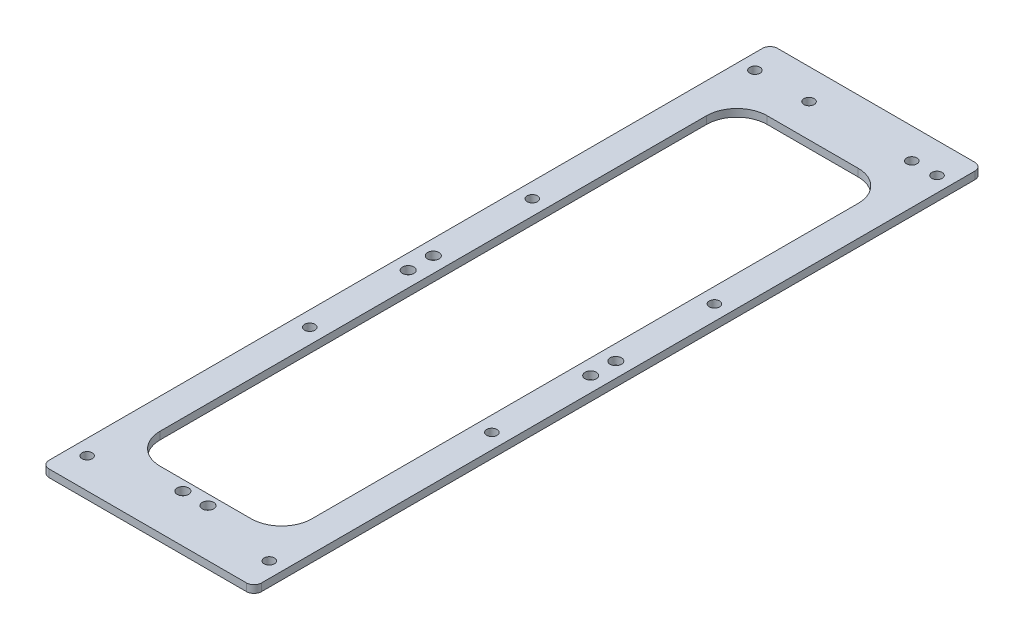
ISO-10303-21;
HEADER;
FILE_DESCRIPTION(('STEP AP214'),'2;1');
FILE_NAME('part.step','',(''),(''),'','','');
FILE_SCHEMA(('AUTOMOTIVE_DESIGN { 1 0 10303 214 1 1 1 1 }'));
ENDSEC;
DATA;
#1=APPLICATION_CONTEXT('core data for automotive mechanical design processes');
#2=APPLICATION_PROTOCOL_DEFINITION('international standard','automotive_design',2000,#1);
#3=PRODUCT_CONTEXT('',#1,'mechanical');
#4=PRODUCT('Part','Part','',(#3));
#5=PRODUCT_RELATED_PRODUCT_CATEGORY('part','',(#4));
#6=PRODUCT_DEFINITION_FORMATION('','',#4);
#7=PRODUCT_DEFINITION_CONTEXT('part definition',#1,'design');
#8=PRODUCT_DEFINITION('design','',#6,#7);
#9=PRODUCT_DEFINITION_SHAPE('','',#8);
#10=(LENGTH_UNIT() NAMED_UNIT(*) SI_UNIT(.MILLI.,.METRE.));
#11=(NAMED_UNIT(*) PLANE_ANGLE_UNIT() SI_UNIT($,.RADIAN.));
#12=(NAMED_UNIT(*) SI_UNIT($,.STERADIAN.) SOLID_ANGLE_UNIT());
#13=UNCERTAINTY_MEASURE_WITH_UNIT(LENGTH_MEASURE(1.E-05),#10,'distance_accuracy_value','');
#14=(GEOMETRIC_REPRESENTATION_CONTEXT(3) GLOBAL_UNCERTAINTY_ASSIGNED_CONTEXT((#13)) GLOBAL_UNIT_ASSIGNED_CONTEXT((#10,
#11,#12)) REPRESENTATION_CONTEXT('',''));
#15=CARTESIAN_POINT('',(0.,0.,0.));
#16=DIRECTION('',(0.,0.,1.));
#17=DIRECTION('',(1.,0.,0.));
#18=AXIS2_PLACEMENT_3D('',#15,#16,#17);
#19=CARTESIAN_POINT('',(0.,3.175,0.));
#20=DIRECTION('',(0.,1.,0.));
#21=DIRECTION('',(0.,0.,1.));
#22=AXIS2_PLACEMENT_3D('',#19,#20,#21);
#23=PLANE('',#22);
#24=CARTESIAN_POINT('',(38.1811171147674,3.175,-5.24625));
#25=DIRECTION('',(0.,1.,0.));
#26=DIRECTION('',(0.,0.,-1.));
#27=AXIS2_PLACEMENT_3D('',#24,#25,#26);
#28=CIRCLE('',#27,2.38125);
#29=CARTESIAN_POINT('',(38.1811171147674,3.175,-7.62749999999999));
#30=VERTEX_POINT('',#29);
#31=EDGE_CURVE('E360',#30,#30,#28,.T.);
#32=ORIENTED_EDGE('',*,*,#31,.F.);
#33=EDGE_LOOP('',(#32));
#34=FACE_BOUND('',#33,.T.);
#35=CARTESIAN_POINT('',(38.1811171147674,3.175,5.24625));
#36=DIRECTION('',(0.,1.,0.));
#37=DIRECTION('',(0.,0.,1.));
#38=AXIS2_PLACEMENT_3D('',#35,#36,#37);
#39=CIRCLE('',#38,2.38125);
#40=CARTESIAN_POINT('',(38.1811171147674,3.175,7.6275));
#41=VERTEX_POINT('',#40);
#42=EDGE_CURVE('E366',#41,#41,#39,.T.);
#43=ORIENTED_EDGE('',*,*,#42,.F.);
#44=EDGE_LOOP('',(#43));
#45=FACE_BOUND('',#44,.T.);
#46=CARTESIAN_POINT('',(-38.1811171147674,3.175,5.24625));
#47=DIRECTION('',(0.,1.,0.));
#48=DIRECTION('',(0.,0.,-1.));
#49=AXIS2_PLACEMENT_3D('',#46,#47,#48);
#50=CIRCLE('',#49,2.38125);
#51=CARTESIAN_POINT('',(-38.1811171147674,3.175,2.86500000000001));
#52=VERTEX_POINT('',#51);
#53=EDGE_CURVE('E372',#52,#52,#50,.T.);
#54=ORIENTED_EDGE('',*,*,#53,.F.);
#55=EDGE_LOOP('',(#54));
#56=FACE_BOUND('',#55,.T.);
#57=CARTESIAN_POINT('',(-38.1811171147674,3.175,-5.24625));
#58=DIRECTION('',(0.,1.,0.));
#59=DIRECTION('',(0.,0.,1.));
#60=AXIS2_PLACEMENT_3D('',#57,#58,#59);
#61=CIRCLE('',#60,2.38125);
#62=CARTESIAN_POINT('',(-38.1811171147674,3.175,-2.865));
#63=VERTEX_POINT('',#62);
#64=EDGE_CURVE('E354',#63,#63,#61,.T.);
#65=ORIENTED_EDGE('',*,*,#64,.F.);
#66=EDGE_LOOP('',(#65));
#67=FACE_BOUND('',#66,.T.);
#68=CARTESIAN_POINT('',(-5.24624998499998,3.175,132.45823257716));
#69=DIRECTION('',(0.,1.,0.));
#70=DIRECTION('',(0.,0.,1.));
#71=AXIS2_PLACEMENT_3D('',#68,#69,#70);
#72=CIRCLE('',#71,2.38125);
#73=CARTESIAN_POINT('',(-5.24624998499998,3.175,134.83948257716));
#74=VERTEX_POINT('',#73);
#75=EDGE_CURVE('E349',#74,#74,#72,.T.);
#76=ORIENTED_EDGE('',*,*,#75,.F.);
#77=EDGE_LOOP('',(#76));
#78=FACE_BOUND('',#77,.T.);
#79=CARTESIAN_POINT('',(5.24624998500002,3.175,132.45823257716));
#80=DIRECTION('',(0.,1.,0.));
#81=DIRECTION('',(0.,0.,-1.));
#82=AXIS2_PLACEMENT_3D('',#79,#80,#81);
#83=CIRCLE('',#82,2.38125);
#84=CARTESIAN_POINT('',(5.24624998500002,3.175,130.07698257716));
#85=VERTEX_POINT('',#84);
#86=EDGE_CURVE('E342',#85,#85,#83,.T.);
#87=ORIENTED_EDGE('',*,*,#86,.F.);
#88=EDGE_LOOP('',(#87));
#89=FACE_BOUND('',#88,.T.);
#90=CARTESIAN_POINT('',(-15.4178,3.175,-139.7));
#91=DIRECTION('',(0.,1.,0.));
#92=DIRECTION('',(0.,0.,1.));
#93=AXIS2_PLACEMENT_3D('',#90,#91,#92);
#94=CIRCLE('',#93,2.15899999999999);
#95=CARTESIAN_POINT('',(-15.4178,3.175,-137.541));
#96=VERTEX_POINT('',#95);
#97=EDGE_CURVE('E337',#96,#96,#94,.T.);
#98=ORIENTED_EDGE('',*,*,#97,.F.);
#99=EDGE_LOOP('',(#98));
#100=FACE_BOUND('',#99,.T.);
#101=CARTESIAN_POINT('',(27.5844,3.175,-139.7));
#102=DIRECTION('',(0.,1.,0.));
#103=DIRECTION('',(0.,0.,1.));
#104=AXIS2_PLACEMENT_3D('',#101,#102,#103);
#105=CIRCLE('',#104,2.15899999999999);
#106=CARTESIAN_POINT('',(27.5844,3.175,-137.541));
#107=VERTEX_POINT('',#106);
#108=EDGE_CURVE('E333',#107,#107,#105,.T.);
#109=ORIENTED_EDGE('',*,*,#108,.F.);
#110=EDGE_LOOP('',(#109));
#111=FACE_BOUND('',#110,.T.);
#112=CARTESIAN_POINT('',(38.1,3.175,-46.6021183814132));
#113=DIRECTION('',(0.,1.,0.));
#114=DIRECTION('',(0.,0.,-1.));
#115=AXIS2_PLACEMENT_3D('',#112,#113,#114);
#116=CIRCLE('',#115,2.15899999999998);
#117=CARTESIAN_POINT('',(38.1,3.175,-48.7611183814132));
#118=VERTEX_POINT('',#117);
#119=EDGE_CURVE('E300',#118,#118,#116,.T.);
#120=ORIENTED_EDGE('',*,*,#119,.F.);
#121=EDGE_LOOP('',(#120));
#122=FACE_BOUND('',#121,.T.);
#123=CARTESIAN_POINT('',(-38.1,3.175,139.663955618587));
#124=DIRECTION('',(0.,1.,0.));
#125=DIRECTION('',(0.,0.,1.));
#126=AXIS2_PLACEMENT_3D('',#123,#124,#125);
#127=CIRCLE('',#126,2.15899999999998);
#128=CARTESIAN_POINT('',(-38.1,3.175,141.822955618587));
#129=VERTEX_POINT('',#128);
#130=EDGE_CURVE('E307',#129,#129,#127,.T.);
#131=ORIENTED_EDGE('',*,*,#130,.F.);
#132=EDGE_LOOP('',(#131));
#133=FACE_BOUND('',#132,.T.);
#134=CARTESIAN_POINT('',(-38.1,3.175,46.5305376185868));
#135=DIRECTION('',(0.,1.,0.));
#136=DIRECTION('',(0.,0.,1.));
#137=AXIS2_PLACEMENT_3D('',#134,#135,#136);
#138=CIRCLE('',#137,2.15899999999998);
#139=CARTESIAN_POINT('',(-38.1,3.175,48.6895376185868));
#140=VERTEX_POINT('',#139);
#141=EDGE_CURVE('E288',#140,#140,#138,.T.);
#142=ORIENTED_EDGE('',*,*,#141,.F.);
#143=EDGE_LOOP('',(#142));
#144=FACE_BOUND('',#143,.T.);
#145=CARTESIAN_POINT('',(-38.1,3.175,-46.6028803814132));
#146=DIRECTION('',(0.,1.,0.));
#147=DIRECTION('',(0.,0.,1.));
#148=AXIS2_PLACEMENT_3D('',#145,#146,#147);
#149=CIRCLE('',#148,2.15899999999998);
#150=CARTESIAN_POINT('',(-38.1,3.175,-44.4438803814132));
#151=VERTEX_POINT('',#150);
#152=EDGE_CURVE('E295',#151,#151,#149,.T.);
#153=ORIENTED_EDGE('',*,*,#152,.F.);
#154=EDGE_LOOP('',(#153));
#155=FACE_BOUND('',#154,.T.);
#156=CARTESIAN_POINT('',(38.1,3.175,46.5320616185868));
#157=DIRECTION('',(0.,1.,0.));
#158=DIRECTION('',(0.,0.,-1.));
#159=AXIS2_PLACEMENT_3D('',#156,#157,#158);
#160=CIRCLE('',#159,2.15899999999998);
#161=CARTESIAN_POINT('',(38.1,3.175,44.3730616185868));
#162=VERTEX_POINT('',#161);
#163=EDGE_CURVE('E325',#162,#162,#160,.T.);
#164=ORIENTED_EDGE('',*,*,#163,.F.);
#165=EDGE_LOOP('',(#164));
#166=FACE_BOUND('',#165,.T.);
#167=CARTESIAN_POINT('',(38.1,3.175,139.666241618587));
#168=DIRECTION('',(0.,1.,0.));
#169=DIRECTION('',(0.,0.,-1.));
#170=AXIS2_PLACEMENT_3D('',#167,#168,#169);
#171=CIRCLE('',#170,2.15899999999998);
#172=CARTESIAN_POINT('',(38.1,3.175,137.507241618587));
#173=VERTEX_POINT('',#172);
#174=EDGE_CURVE('E319',#173,#173,#171,.T.);
#175=ORIENTED_EDGE('',*,*,#174,.F.);
#176=EDGE_LOOP('',(#175));
#177=FACE_BOUND('',#176,.T.);
#178=CARTESIAN_POINT('',(38.1,3.175,-139.736298381413));
#179=DIRECTION('',(0.,1.,0.));
#180=DIRECTION('',(0.,0.,-1.));
#181=AXIS2_PLACEMENT_3D('',#178,#179,#180);
#182=CIRCLE('',#181,2.15899999999998);
#183=CARTESIAN_POINT('',(38.1,3.175,-141.895298381413));
#184=VERTEX_POINT('',#183);
#185=EDGE_CURVE('E312',#184,#184,#182,.T.);
#186=ORIENTED_EDGE('',*,*,#185,.F.);
#187=EDGE_LOOP('',(#186));
#188=FACE_BOUND('',#187,.T.);
#189=CARTESIAN_POINT('',(-38.1,3.175,-139.736298381413));
#190=DIRECTION('',(0.,1.,0.));
#191=DIRECTION('',(0.,0.,1.));
#192=AXIS2_PLACEMENT_3D('',#189,#190,#191);
#193=CIRCLE('',#192,2.15899999999998);
#194=CARTESIAN_POINT('',(-38.1,3.175,-137.577298381413));
#195=VERTEX_POINT('',#194);
#196=EDGE_CURVE('E282',#195,#195,#193,.T.);
#197=ORIENTED_EDGE('',*,*,#196,.F.);
#198=EDGE_LOOP('',(#197));
#199=FACE_BOUND('',#198,.T.);
#200=DIRECTION('',(0.,0.,1.));
#201=VECTOR('',#200,1.);
#202=CARTESIAN_POINT('',(-44.45,3.175,-152.4));
#203=LINE('',#202,#201);
#204=CARTESIAN_POINT('',(-44.45,3.175,-149.225));
#205=VERTEX_POINT('',#204);
#206=CARTESIAN_POINT('',(-44.45,3.175,149.225));
#207=VERTEX_POINT('',#206);
#208=EDGE_CURVE('E253',#205,#207,#203,.T.);
#209=ORIENTED_EDGE('',*,*,#208,.T.);
#210=CARTESIAN_POINT('',(-41.275,3.175,149.225));
#211=DIRECTION('',(0.,1.,0.));
#212=DIRECTION('',(0.,0.,1.));
#213=AXIS2_PLACEMENT_3D('',#210,#211,#212);
#214=CIRCLE('',#213,3.175);
#215=CARTESIAN_POINT('',(-41.275,3.175,152.4));
#216=VERTEX_POINT('',#215);
#217=EDGE_CURVE('E232',#207,#216,#214,.T.);
#218=ORIENTED_EDGE('',*,*,#217,.T.);
#219=DIRECTION('',(1.,0.,0.));
#220=VECTOR('',#219,1.);
#221=CARTESIAN_POINT('',(-44.45,3.175,152.4));
#222=LINE('',#221,#220);
#223=CARTESIAN_POINT('',(41.275,3.175,152.4));
#224=VERTEX_POINT('',#223);
#225=EDGE_CURVE('E261',#216,#224,#222,.T.);
#226=ORIENTED_EDGE('',*,*,#225,.T.);
#227=CARTESIAN_POINT('',(41.275,3.175,149.225));
#228=DIRECTION('',(0.,1.,0.));
#229=DIRECTION('',(0.,0.,1.));
#230=AXIS2_PLACEMENT_3D('',#227,#228,#229);
#231=CIRCLE('',#230,3.175);
#232=CARTESIAN_POINT('',(44.45,3.175,149.225));
#233=VERTEX_POINT('',#232);
#234=EDGE_CURVE('E230',#224,#233,#231,.T.);
#235=ORIENTED_EDGE('',*,*,#234,.T.);
#236=DIRECTION('',(0.,0.,-1.));
#237=VECTOR('',#236,1.);
#238=CARTESIAN_POINT('',(44.45,3.175,-152.4));
#239=LINE('',#238,#237);
#240=CARTESIAN_POINT('',(44.45,3.175,-149.225));
#241=VERTEX_POINT('',#240);
#242=EDGE_CURVE('E178',#233,#241,#239,.T.);
#243=ORIENTED_EDGE('',*,*,#242,.T.);
#244=CARTESIAN_POINT('',(41.275,3.175,-149.225));
#245=DIRECTION('',(0.,1.,0.));
#246=DIRECTION('',(0.,0.,1.));
#247=AXIS2_PLACEMENT_3D('',#244,#245,#246);
#248=CIRCLE('',#247,3.175);
#249=CARTESIAN_POINT('',(41.275,3.175,-152.4));
#250=VERTEX_POINT('',#249);
#251=EDGE_CURVE('E55',#241,#250,#248,.T.);
#252=ORIENTED_EDGE('',*,*,#251,.T.);
#253=DIRECTION('',(-1.,0.,0.));
#254=VECTOR('',#253,1.);
#255=CARTESIAN_POINT('',(-44.45,3.175,-152.4));
#256=LINE('',#255,#254);
#257=CARTESIAN_POINT('',(-41.275,3.175,-152.4));
#258=VERTEX_POINT('',#257);
#259=EDGE_CURVE('E174',#250,#258,#256,.T.);
#260=ORIENTED_EDGE('',*,*,#259,.T.);
#261=CARTESIAN_POINT('',(-41.275,3.175,-149.225));
#262=DIRECTION('',(0.,1.,0.));
#263=DIRECTION('',(0.,0.,1.));
#264=AXIS2_PLACEMENT_3D('',#261,#262,#263);
#265=CIRCLE('',#264,3.175);
#266=EDGE_CURVE('E227',#258,#205,#265,.T.);
#267=ORIENTED_EDGE('',*,*,#266,.T.);
#268=EDGE_LOOP('',(#209,#218,#226,#235,#243,#252,#260,#267));
#269=FACE_BOUND('',#268,.T.);
#270=DIRECTION('',(1.,0.,0.));
#271=VECTOR('',#270,1.);
#272=CARTESIAN_POINT('',(-31.75,3.175,128.17693257716));
#273=LINE('',#272,#271);
#274=CARTESIAN_POINT('',(-19.05,3.175,128.17693257716));
#275=VERTEX_POINT('',#274);
#276=CARTESIAN_POINT('',(19.05,3.175,128.17693257716));
#277=VERTEX_POINT('',#276);
#278=EDGE_CURVE('E278',#275,#277,#273,.T.);
#279=ORIENTED_EDGE('',*,*,#278,.F.);
#280=CARTESIAN_POINT('',(-19.05,3.175,115.47693257716));
#281=DIRECTION('',(0.,1.,0.));
#282=DIRECTION('',(0.,0.,1.));
#283=AXIS2_PLACEMENT_3D('',#280,#281,#282);
#284=CIRCLE('',#283,12.7);
#285=CARTESIAN_POINT('',(-31.75,3.175,115.47693257716));
#286=VERTEX_POINT('',#285);
#287=EDGE_CURVE('E159',#275,#286,#284,.F.);
#288=ORIENTED_EDGE('',*,*,#287,.T.);
#289=DIRECTION('',(0.,0.,1.));
#290=VECTOR('',#289,1.);
#291=CARTESIAN_POINT('',(-31.75,3.175,-125.82306742284));
#292=LINE('',#291,#290);
#293=CARTESIAN_POINT('',(-31.75,3.175,-113.12306742284));
#294=VERTEX_POINT('',#293);
#295=EDGE_CURVE('E268',#294,#286,#292,.T.);
#296=ORIENTED_EDGE('',*,*,#295,.F.);
#297=CARTESIAN_POINT('',(-19.05,3.175,-113.12306742284));
#298=DIRECTION('',(0.,1.,0.));
#299=DIRECTION('',(0.,0.,1.));
#300=AXIS2_PLACEMENT_3D('',#297,#298,#299);
#301=CIRCLE('',#300,12.7);
#302=CARTESIAN_POINT('',(-19.05,3.175,-125.82306742284));
#303=VERTEX_POINT('',#302);
#304=EDGE_CURVE('E203',#294,#303,#301,.F.);
#305=ORIENTED_EDGE('',*,*,#304,.T.);
#306=DIRECTION('',(-1.,0.,0.));
#307=VECTOR('',#306,1.);
#308=CARTESIAN_POINT('',(-31.75,3.175,-125.82306742284));
#309=LINE('',#308,#307);
#310=CARTESIAN_POINT('',(19.05,3.175,-125.82306742284));
#311=VERTEX_POINT('',#310);
#312=EDGE_CURVE('E258',#311,#303,#309,.T.);
#313=ORIENTED_EDGE('',*,*,#312,.F.);
#314=CARTESIAN_POINT('',(19.0500000000001,3.175,-113.12306742284));
#315=DIRECTION('',(0.,1.,0.));
#316=DIRECTION('',(0.,0.,1.));
#317=AXIS2_PLACEMENT_3D('',#314,#315,#316);
#318=CIRCLE('',#317,12.7);
#319=CARTESIAN_POINT('',(31.75,3.175,-113.12306742284));
#320=VERTEX_POINT('',#319);
#321=EDGE_CURVE('E207',#311,#320,#318,.F.);
#322=ORIENTED_EDGE('',*,*,#321,.T.);
#323=DIRECTION('',(0.,0.,-1.));
#324=VECTOR('',#323,1.);
#325=CARTESIAN_POINT('',(31.75,3.175,-125.82306742284));
#326=LINE('',#325,#324);
#327=CARTESIAN_POINT('',(31.75,3.175,115.47693257716));
#328=VERTEX_POINT('',#327);
#329=EDGE_CURVE('E275',#328,#320,#326,.T.);
#330=ORIENTED_EDGE('',*,*,#329,.F.);
#331=CARTESIAN_POINT('',(19.05,3.175,115.47693257716));
#332=DIRECTION('',(0.,1.,0.));
#333=DIRECTION('',(0.,0.,1.));
#334=AXIS2_PLACEMENT_3D('',#331,#332,#333);
#335=CIRCLE('',#334,12.7);
#336=EDGE_CURVE('E160',#328,#277,#335,.F.);
#337=ORIENTED_EDGE('',*,*,#336,.T.);
#338=EDGE_LOOP('',(#279,#288,#296,#305,#313,#322,#330,#337));
#339=FACE_BOUND('',#338,.T.);
#340=ADVANCED_FACE('F34',(#34,#45,#56,#67,#78,#89,#100,#111,#122,#133,#144,#155,#166,#177,#188,
#199,#269,#339),#23,.T.);
#341=CARTESIAN_POINT('',(0.,0.,0.));
#342=DIRECTION('',(0.,1.,0.));
#343=DIRECTION('',(0.,0.,1.));
#344=AXIS2_PLACEMENT_3D('',#341,#342,#343);
#345=PLANE('',#344);
#346=CARTESIAN_POINT('',(38.1811171147674,0.,-5.24625));
#347=DIRECTION('',(0.,1.,0.));
#348=DIRECTION('',(0.,0.,-1.));
#349=AXIS2_PLACEMENT_3D('',#346,#347,#348);
#350=CIRCLE('',#349,2.38125);
#351=CARTESIAN_POINT('',(38.1811171147674,0.,-7.62749999999999));
#352=VERTEX_POINT('',#351);
#353=EDGE_CURVE('E363',#352,#352,#350,.T.);
#354=ORIENTED_EDGE('',*,*,#353,.T.);
#355=EDGE_LOOP('',(#354));
#356=FACE_BOUND('',#355,.T.);
#357=CARTESIAN_POINT('',(38.1811171147674,0.,5.24625));
#358=DIRECTION('',(0.,1.,0.));
#359=DIRECTION('',(0.,0.,1.));
#360=AXIS2_PLACEMENT_3D('',#357,#358,#359);
#361=CIRCLE('',#360,2.38125);
#362=CARTESIAN_POINT('',(38.1811171147674,0.,7.6275));
#363=VERTEX_POINT('',#362);
#364=EDGE_CURVE('E369',#363,#363,#361,.T.);
#365=ORIENTED_EDGE('',*,*,#364,.T.);
#366=EDGE_LOOP('',(#365));
#367=FACE_BOUND('',#366,.T.);
#368=CARTESIAN_POINT('',(-38.1811171147674,0.,5.24625));
#369=DIRECTION('',(0.,1.,0.));
#370=DIRECTION('',(0.,0.,-1.));
#371=AXIS2_PLACEMENT_3D('',#368,#369,#370);
#372=CIRCLE('',#371,2.38125);
#373=CARTESIAN_POINT('',(-38.1811171147674,0.,2.86500000000001));
#374=VERTEX_POINT('',#373);
#375=EDGE_CURVE('E357',#374,#374,#372,.T.);
#376=ORIENTED_EDGE('',*,*,#375,.T.);
#377=EDGE_LOOP('',(#376));
#378=FACE_BOUND('',#377,.T.);
#379=CARTESIAN_POINT('',(-38.1811171147674,0.,-5.24625));
#380=DIRECTION('',(0.,1.,0.));
#381=DIRECTION('',(0.,0.,1.));
#382=AXIS2_PLACEMENT_3D('',#379,#380,#381);
#383=CIRCLE('',#382,2.38125);
#384=CARTESIAN_POINT('',(-38.1811171147674,0.,-2.865));
#385=VERTEX_POINT('',#384);
#386=EDGE_CURVE('E346',#385,#385,#383,.T.);
#387=ORIENTED_EDGE('',*,*,#386,.T.);
#388=EDGE_LOOP('',(#387));
#389=FACE_BOUND('',#388,.T.);
#390=CARTESIAN_POINT('',(-5.24624998499998,0.,132.45823257716));
#391=DIRECTION('',(0.,1.,0.));
#392=DIRECTION('',(0.,0.,1.));
#393=AXIS2_PLACEMENT_3D('',#390,#391,#392);
#394=CIRCLE('',#393,2.38125);
#395=CARTESIAN_POINT('',(-5.24624998499998,0.,134.83948257716));
#396=VERTEX_POINT('',#395);
#397=EDGE_CURVE('E334',#396,#396,#394,.T.);
#398=ORIENTED_EDGE('',*,*,#397,.T.);
#399=EDGE_LOOP('',(#398));
#400=FACE_BOUND('',#399,.T.);
#401=CARTESIAN_POINT('',(5.24624998500002,0.,132.45823257716));
#402=DIRECTION('',(0.,1.,0.));
#403=DIRECTION('',(0.,0.,-1.));
#404=AXIS2_PLACEMENT_3D('',#401,#402,#403);
#405=CIRCLE('',#404,2.38125);
#406=CARTESIAN_POINT('',(5.24624998500002,0.,130.07698257716));
#407=VERTEX_POINT('',#406);
#408=EDGE_CURVE('E345',#407,#407,#405,.T.);
#409=ORIENTED_EDGE('',*,*,#408,.T.);
#410=EDGE_LOOP('',(#409));
#411=FACE_BOUND('',#410,.T.);
#412=CARTESIAN_POINT('',(-15.4178,0.,-139.7));
#413=DIRECTION('',(0.,1.,0.));
#414=DIRECTION('',(0.,0.,1.));
#415=AXIS2_PLACEMENT_3D('',#412,#413,#414);
#416=CIRCLE('',#415,2.15899999999999);
#417=CARTESIAN_POINT('',(-15.4178,0.,-137.541));
#418=VERTEX_POINT('',#417);
#419=EDGE_CURVE('E316',#418,#418,#416,.T.);
#420=ORIENTED_EDGE('',*,*,#419,.T.);
#421=EDGE_LOOP('',(#420));
#422=FACE_BOUND('',#421,.T.);
#423=CARTESIAN_POINT('',(27.5844,0.,-139.7));
#424=DIRECTION('',(0.,1.,0.));
#425=DIRECTION('',(0.,0.,1.));
#426=AXIS2_PLACEMENT_3D('',#423,#424,#425);
#427=CIRCLE('',#426,2.15899999999999);
#428=CARTESIAN_POINT('',(27.5844,0.,-137.541));
#429=VERTEX_POINT('',#428);
#430=EDGE_CURVE('E330',#429,#429,#427,.T.);
#431=ORIENTED_EDGE('',*,*,#430,.T.);
#432=EDGE_LOOP('',(#431));
#433=FACE_BOUND('',#432,.T.);
#434=CARTESIAN_POINT('',(38.1,0.,-46.6021183814132));
#435=DIRECTION('',(0.,1.,0.));
#436=DIRECTION('',(0.,0.,-1.));
#437=AXIS2_PLACEMENT_3D('',#434,#435,#436);
#438=CIRCLE('',#437,2.15899999999998);
#439=CARTESIAN_POINT('',(38.1,0.,-48.7611183814132));
#440=VERTEX_POINT('',#439);
#441=EDGE_CURVE('E303',#440,#440,#438,.T.);
#442=ORIENTED_EDGE('',*,*,#441,.T.);
#443=EDGE_LOOP('',(#442));
#444=FACE_BOUND('',#443,.T.);
#445=CARTESIAN_POINT('',(-38.1,0.,139.663955618587));
#446=DIRECTION('',(0.,1.,0.));
#447=DIRECTION('',(0.,0.,1.));
#448=AXIS2_PLACEMENT_3D('',#445,#446,#447);
#449=CIRCLE('',#448,2.15899999999998);
#450=CARTESIAN_POINT('',(-38.1,0.,141.822955618587));
#451=VERTEX_POINT('',#450);
#452=EDGE_CURVE('E292',#451,#451,#449,.T.);
#453=ORIENTED_EDGE('',*,*,#452,.T.);
#454=EDGE_LOOP('',(#453));
#455=FACE_BOUND('',#454,.T.);
#456=CARTESIAN_POINT('',(-38.1,0.,46.5305376185868));
#457=DIRECTION('',(0.,1.,0.));
#458=DIRECTION('',(0.,0.,1.));
#459=AXIS2_PLACEMENT_3D('',#456,#457,#458);
#460=CIRCLE('',#459,2.15899999999998);
#461=CARTESIAN_POINT('',(-38.1,0.,48.6895376185868));
#462=VERTEX_POINT('',#461);
#463=EDGE_CURVE('E291',#462,#462,#460,.T.);
#464=ORIENTED_EDGE('',*,*,#463,.T.);
#465=EDGE_LOOP('',(#464));
#466=FACE_BOUND('',#465,.T.);
#467=CARTESIAN_POINT('',(-38.1,0.,-46.6028803814132));
#468=DIRECTION('',(0.,1.,0.));
#469=DIRECTION('',(0.,0.,1.));
#470=AXIS2_PLACEMENT_3D('',#467,#468,#469);
#471=CIRCLE('',#470,2.15899999999998);
#472=CARTESIAN_POINT('',(-38.1,0.,-44.4438803814132));
#473=VERTEX_POINT('',#472);
#474=EDGE_CURVE('E285',#473,#473,#471,.T.);
#475=ORIENTED_EDGE('',*,*,#474,.T.);
#476=EDGE_LOOP('',(#475));
#477=FACE_BOUND('',#476,.T.);
#478=CARTESIAN_POINT('',(38.1,0.,46.5320616185868));
#479=DIRECTION('',(0.,1.,0.));
#480=DIRECTION('',(0.,0.,-1.));
#481=AXIS2_PLACEMENT_3D('',#478,#479,#480);
#482=CIRCLE('',#481,2.15899999999998);
#483=CARTESIAN_POINT('',(38.1,0.,44.3730616185868));
#484=VERTEX_POINT('',#483);
#485=EDGE_CURVE('E304',#484,#484,#482,.T.);
#486=ORIENTED_EDGE('',*,*,#485,.T.);
#487=EDGE_LOOP('',(#486));
#488=FACE_BOUND('',#487,.T.);
#489=CARTESIAN_POINT('',(38.1,0.,139.666241618587));
#490=DIRECTION('',(0.,1.,0.));
#491=DIRECTION('',(0.,0.,-1.));
#492=AXIS2_PLACEMENT_3D('',#489,#490,#491);
#493=CIRCLE('',#492,2.15899999999998);
#494=CARTESIAN_POINT('',(38.1,0.,137.507241618587));
#495=VERTEX_POINT('',#494);
#496=EDGE_CURVE('E322',#495,#495,#493,.T.);
#497=ORIENTED_EDGE('',*,*,#496,.T.);
#498=EDGE_LOOP('',(#497));
#499=FACE_BOUND('',#498,.T.);
#500=CARTESIAN_POINT('',(38.1,0.,-139.736298381413));
#501=DIRECTION('',(0.,1.,0.));
#502=DIRECTION('',(0.,0.,-1.));
#503=AXIS2_PLACEMENT_3D('',#500,#501,#502);
#504=CIRCLE('',#503,2.15899999999998);
#505=CARTESIAN_POINT('',(38.1,0.,-141.895298381413));
#506=VERTEX_POINT('',#505);
#507=EDGE_CURVE('E315',#506,#506,#504,.T.);
#508=ORIENTED_EDGE('',*,*,#507,.T.);
#509=EDGE_LOOP('',(#508));
#510=FACE_BOUND('',#509,.T.);
#511=CARTESIAN_POINT('',(-38.1,0.,-139.736298381413));
#512=DIRECTION('',(0.,1.,0.));
#513=DIRECTION('',(0.,0.,1.));
#514=AXIS2_PLACEMENT_3D('',#511,#512,#513);
#515=CIRCLE('',#514,2.15899999999998);
#516=CARTESIAN_POINT('',(-38.1,0.,-137.577298381413));
#517=VERTEX_POINT('',#516);
#518=EDGE_CURVE('E272',#517,#517,#515,.T.);
#519=ORIENTED_EDGE('',*,*,#518,.T.);
#520=EDGE_LOOP('',(#519));
#521=FACE_BOUND('',#520,.T.);
#522=DIRECTION('',(1.,0.,0.));
#523=VECTOR('',#522,1.);
#524=CARTESIAN_POINT('',(-44.45,0.,152.4));
#525=LINE('',#524,#523);
#526=CARTESIAN_POINT('',(-41.275,0.,152.4));
#527=VERTEX_POINT('',#526);
#528=CARTESIAN_POINT('',(41.275,0.,152.4));
#529=VERTEX_POINT('',#528);
#530=EDGE_CURVE('E252',#527,#529,#525,.T.);
#531=ORIENTED_EDGE('',*,*,#530,.F.);
#532=CARTESIAN_POINT('',(-41.275,0.,149.225));
#533=DIRECTION('',(0.,1.,0.));
#534=DIRECTION('',(0.,0.,1.));
#535=AXIS2_PLACEMENT_3D('',#532,#533,#534);
#536=CIRCLE('',#535,3.175);
#537=CARTESIAN_POINT('',(-44.45,0.,149.225));
#538=VERTEX_POINT('',#537);
#539=EDGE_CURVE('E220',#527,#538,#536,.F.);
#540=ORIENTED_EDGE('',*,*,#539,.T.);
#541=DIRECTION('',(0.,0.,1.));
#542=VECTOR('',#541,1.);
#543=CARTESIAN_POINT('',(-44.45,0.,-152.4));
#544=LINE('',#543,#542);
#545=CARTESIAN_POINT('',(-44.45,0.,-149.225));
#546=VERTEX_POINT('',#545);
#547=EDGE_CURVE('E254',#546,#538,#544,.T.);
#548=ORIENTED_EDGE('',*,*,#547,.F.);
#549=CARTESIAN_POINT('',(-41.275,0.,-149.225));
#550=DIRECTION('',(0.,1.,0.));
#551=DIRECTION('',(0.,0.,1.));
#552=AXIS2_PLACEMENT_3D('',#549,#550,#551);
#553=CIRCLE('',#552,3.175);
#554=CARTESIAN_POINT('',(-41.275,0.,-152.4));
#555=VERTEX_POINT('',#554);
#556=EDGE_CURVE('E214',#546,#555,#553,.F.);
#557=ORIENTED_EDGE('',*,*,#556,.T.);
#558=DIRECTION('',(-1.,0.,0.));
#559=VECTOR('',#558,1.);
#560=CARTESIAN_POINT('',(-44.45,0.,-152.4));
#561=LINE('',#560,#559);
#562=CARTESIAN_POINT('',(41.275,0.,-152.4));
#563=VERTEX_POINT('',#562);
#564=EDGE_CURVE('E181',#563,#555,#561,.T.);
#565=ORIENTED_EDGE('',*,*,#564,.F.);
#566=CARTESIAN_POINT('',(41.275,0.,-149.225));
#567=DIRECTION('',(0.,1.,0.));
#568=DIRECTION('',(0.,0.,1.));
#569=AXIS2_PLACEMENT_3D('',#566,#567,#568);
#570=CIRCLE('',#569,3.175);
#571=CARTESIAN_POINT('',(44.45,0.,-149.225));
#572=VERTEX_POINT('',#571);
#573=EDGE_CURVE('E216',#563,#572,#570,.F.);
#574=ORIENTED_EDGE('',*,*,#573,.T.);
#575=DIRECTION('',(0.,0.,-1.));
#576=VECTOR('',#575,1.);
#577=CARTESIAN_POINT('',(44.45,0.,-152.4));
#578=LINE('',#577,#576);
#579=CARTESIAN_POINT('',(44.45,0.,149.225));
#580=VERTEX_POINT('',#579);
#581=EDGE_CURVE('E244',#580,#572,#578,.T.);
#582=ORIENTED_EDGE('',*,*,#581,.F.);
#583=CARTESIAN_POINT('',(41.275,0.,149.225));
#584=DIRECTION('',(0.,1.,0.));
#585=DIRECTION('',(0.,0.,1.));
#586=AXIS2_PLACEMENT_3D('',#583,#584,#585);
#587=CIRCLE('',#586,3.175);
#588=EDGE_CURVE('E218',#580,#529,#587,.F.);
#589=ORIENTED_EDGE('',*,*,#588,.T.);
#590=EDGE_LOOP('',(#531,#540,#548,#557,#565,#574,#582,#589));
#591=FACE_BOUND('',#590,.T.);
#592=DIRECTION('',(-1.,0.,0.));
#593=VECTOR('',#592,1.);
#594=CARTESIAN_POINT('',(-31.75,0.,-125.82306742284));
#595=LINE('',#594,#593);
#596=CARTESIAN_POINT('',(19.05,0.,-125.82306742284));
#597=VERTEX_POINT('',#596);
#598=CARTESIAN_POINT('',(-19.05,0.,-125.82306742284));
#599=VERTEX_POINT('',#598);
#600=EDGE_CURVE('E266',#597,#599,#595,.T.);
#601=ORIENTED_EDGE('',*,*,#600,.T.);
#602=CARTESIAN_POINT('',(-19.05,0.,-113.12306742284));
#603=DIRECTION('',(0.,1.,0.));
#604=DIRECTION('',(0.,0.,1.));
#605=AXIS2_PLACEMENT_3D('',#602,#603,#604);
#606=CIRCLE('',#605,12.7);
#607=CARTESIAN_POINT('',(-31.75,0.,-113.12306742284));
#608=VERTEX_POINT('',#607);
#609=EDGE_CURVE('E201',#599,#608,#606,.T.);
#610=ORIENTED_EDGE('',*,*,#609,.T.);
#611=DIRECTION('',(0.,0.,1.));
#612=VECTOR('',#611,1.);
#613=CARTESIAN_POINT('',(-31.75,0.,-125.82306742284));
#614=LINE('',#613,#612);
#615=CARTESIAN_POINT('',(-31.75,0.,115.47693257716));
#616=VERTEX_POINT('',#615);
#617=EDGE_CURVE('E154',#608,#616,#614,.T.);
#618=ORIENTED_EDGE('',*,*,#617,.T.);
#619=CARTESIAN_POINT('',(-19.05,0.,115.47693257716));
#620=DIRECTION('',(0.,1.,0.));
#621=DIRECTION('',(0.,0.,1.));
#622=AXIS2_PLACEMENT_3D('',#619,#620,#621);
#623=CIRCLE('',#622,12.7);
#624=CARTESIAN_POINT('',(-19.05,0.,128.17693257716));
#625=VERTEX_POINT('',#624);
#626=EDGE_CURVE('E148',#616,#625,#623,.T.);
#627=ORIENTED_EDGE('',*,*,#626,.T.);
#628=DIRECTION('',(1.,0.,0.));
#629=VECTOR('',#628,1.);
#630=CARTESIAN_POINT('',(-31.75,0.,128.17693257716));
#631=LINE('',#630,#629);
#632=CARTESIAN_POINT('',(19.05,0.,128.17693257716));
#633=VERTEX_POINT('',#632);
#634=EDGE_CURVE('E152',#625,#633,#631,.T.);
#635=ORIENTED_EDGE('',*,*,#634,.T.);
#636=CARTESIAN_POINT('',(19.05,0.,115.47693257716));
#637=DIRECTION('',(0.,1.,0.));
#638=DIRECTION('',(0.,0.,1.));
#639=AXIS2_PLACEMENT_3D('',#636,#637,#638);
#640=CIRCLE('',#639,12.7);
#641=CARTESIAN_POINT('',(31.75,0.,115.47693257716));
#642=VERTEX_POINT('',#641);
#643=EDGE_CURVE('E197',#633,#642,#640,.T.);
#644=ORIENTED_EDGE('',*,*,#643,.T.);
#645=DIRECTION('',(0.,0.,-1.));
#646=VECTOR('',#645,1.);
#647=CARTESIAN_POINT('',(31.75,0.,-125.82306742284));
#648=LINE('',#647,#646);
#649=CARTESIAN_POINT('',(31.75,0.,-113.12306742284));
#650=VERTEX_POINT('',#649);
#651=EDGE_CURVE('E170',#642,#650,#648,.T.);
#652=ORIENTED_EDGE('',*,*,#651,.T.);
#653=CARTESIAN_POINT('',(19.0500000000001,0.,-113.12306742284));
#654=DIRECTION('',(0.,1.,0.));
#655=DIRECTION('',(0.,0.,1.));
#656=AXIS2_PLACEMENT_3D('',#653,#654,#655);
#657=CIRCLE('',#656,12.7);
#658=EDGE_CURVE('E205',#650,#597,#657,.T.);
#659=ORIENTED_EDGE('',*,*,#658,.T.);
#660=EDGE_LOOP('',(#601,#610,#618,#627,#635,#644,#652,#659));
#661=FACE_BOUND('',#660,.T.);
#662=ADVANCED_FACE('F151',(#356,#367,#378,#389,#400,#411,#422,#433,#444,#455,#466,#477,#488,
#499,#510,#521,#591,#661),#345,.F.);
#663=CARTESIAN_POINT('',(-44.45,3.175,-152.4));
#664=DIRECTION('',(1.,0.,0.));
#665=DIRECTION('',(0.,0.,-1.));
#666=AXIS2_PLACEMENT_3D('',#663,#664,#665);
#667=PLANE('',#666);
#668=ORIENTED_EDGE('',*,*,#547,.T.);
#669=DIRECTION('',(0.,-1.,0.));
#670=VECTOR('',#669,1.);
#671=CARTESIAN_POINT('',(-44.45,3.175,149.225));
#672=LINE('',#671,#670);
#673=EDGE_CURVE('E225',#538,#207,#672,.F.);
#674=ORIENTED_EDGE('',*,*,#673,.T.);
#675=ORIENTED_EDGE('',*,*,#208,.F.);
#676=DIRECTION('',(0.,-1.,0.));
#677=VECTOR('',#676,1.);
#678=CARTESIAN_POINT('',(-44.45,3.175,-149.225));
#679=LINE('',#678,#677);
#680=EDGE_CURVE('E222',#205,#546,#679,.T.);
#681=ORIENTED_EDGE('',*,*,#680,.T.);
#682=EDGE_LOOP('',(#668,#674,#675,#681));
#683=FACE_BOUND('',#682,.T.);
#684=ADVANCED_FACE('F457',(#683),#667,.F.);
#685=CARTESIAN_POINT('',(-44.45,3.175,152.4));
#686=DIRECTION('',(0.,0.,-1.));
#687=DIRECTION('',(-1.,0.,0.));
#688=AXIS2_PLACEMENT_3D('',#685,#686,#687);
#689=PLANE('',#688);
#690=ORIENTED_EDGE('',*,*,#225,.F.);
#691=DIRECTION('',(0.,-1.,0.));
#692=VECTOR('',#691,1.);
#693=CARTESIAN_POINT('',(-41.275,3.175,152.4));
#694=LINE('',#693,#692);
#695=EDGE_CURVE('E211',#216,#527,#694,.T.);
#696=ORIENTED_EDGE('',*,*,#695,.T.);
#697=ORIENTED_EDGE('',*,*,#530,.T.);
#698=DIRECTION('',(0.,-1.,0.));
#699=VECTOR('',#698,1.);
#700=CARTESIAN_POINT('',(41.275,3.175,152.4));
#701=LINE('',#700,#699);
#702=EDGE_CURVE('E209',#529,#224,#701,.F.);
#703=ORIENTED_EDGE('',*,*,#702,.T.);
#704=EDGE_LOOP('',(#690,#696,#697,#703));
#705=FACE_BOUND('',#704,.T.);
#706=ADVANCED_FACE('F462',(#705),#689,.F.);
#707=CARTESIAN_POINT('',(44.45,3.175,-152.4));
#708=DIRECTION('',(-1.,0.,0.));
#709=DIRECTION('',(0.,0.,1.));
#710=AXIS2_PLACEMENT_3D('',#707,#708,#709);
#711=PLANE('',#710);
#712=ORIENTED_EDGE('',*,*,#242,.F.);
#713=DIRECTION('',(0.,-1.,0.));
#714=VECTOR('',#713,1.);
#715=CARTESIAN_POINT('',(44.45,3.175,149.225));
#716=LINE('',#715,#714);
#717=EDGE_CURVE('E236',#233,#580,#716,.T.);
#718=ORIENTED_EDGE('',*,*,#717,.T.);
#719=ORIENTED_EDGE('',*,*,#581,.T.);
#720=DIRECTION('',(0.,-1.,0.));
#721=VECTOR('',#720,1.);
#722=CARTESIAN_POINT('',(44.45,3.175,-149.225));
#723=LINE('',#722,#721);
#724=EDGE_CURVE('E234',#572,#241,#723,.F.);
#725=ORIENTED_EDGE('',*,*,#724,.T.);
#726=EDGE_LOOP('',(#712,#718,#719,#725));
#727=FACE_BOUND('',#726,.T.);
#728=ADVANCED_FACE('F243',(#727),#711,.F.);
#729=CARTESIAN_POINT('',(-44.45,3.175,-152.4));
#730=DIRECTION('',(0.,0.,1.));
#731=DIRECTION('',(1.,0.,0.));
#732=AXIS2_PLACEMENT_3D('',#729,#730,#731);
#733=PLANE('',#732);
#734=ORIENTED_EDGE('',*,*,#259,.F.);
#735=DIRECTION('',(0.,-1.,0.));
#736=VECTOR('',#735,1.);
#737=CARTESIAN_POINT('',(41.275,3.175,-152.4));
#738=LINE('',#737,#736);
#739=EDGE_CURVE('E11',#250,#563,#738,.T.);
#740=ORIENTED_EDGE('',*,*,#739,.T.);
#741=ORIENTED_EDGE('',*,*,#564,.T.);
#742=DIRECTION('',(0.,-1.,0.));
#743=VECTOR('',#742,1.);
#744=CARTESIAN_POINT('',(-41.275,3.175,-152.4));
#745=LINE('',#744,#743);
#746=EDGE_CURVE('E42',#555,#258,#745,.F.);
#747=ORIENTED_EDGE('',*,*,#746,.T.);
#748=EDGE_LOOP('',(#734,#740,#741,#747));
#749=FACE_BOUND('',#748,.T.);
#750=ADVANCED_FACE('F446',(#749),#733,.F.);
#751=CARTESIAN_POINT('',(-31.75,3.175,-125.82306742284));
#752=DIRECTION('',(1.,0.,0.));
#753=DIRECTION('',(0.,0.,-1.));
#754=AXIS2_PLACEMENT_3D('',#751,#752,#753);
#755=PLANE('',#754);
#756=ORIENTED_EDGE('',*,*,#295,.T.);
#757=DIRECTION('',(0.,-1.,0.));
#758=VECTOR('',#757,1.);
#759=CARTESIAN_POINT('',(-31.75,0.,115.47693257716));
#760=LINE('',#759,#758);
#761=EDGE_CURVE('E190',#286,#616,#760,.T.);
#762=ORIENTED_EDGE('',*,*,#761,.T.);
#763=ORIENTED_EDGE('',*,*,#617,.F.);
#764=DIRECTION('',(0.,-1.,0.));
#765=VECTOR('',#764,1.);
#766=CARTESIAN_POINT('',(-31.75,3.175,-113.12306742284));
#767=LINE('',#766,#765);
#768=EDGE_CURVE('E188',#608,#294,#767,.F.);
#769=ORIENTED_EDGE('',*,*,#768,.T.);
#770=EDGE_LOOP('',(#756,#762,#763,#769));
#771=FACE_BOUND('',#770,.T.);
#772=ADVANCED_FACE('F444',(#771),#755,.T.);
#773=CARTESIAN_POINT('',(-31.75,3.175,128.17693257716));
#774=DIRECTION('',(0.,0.,-1.));
#775=DIRECTION('',(-1.,0.,0.));
#776=AXIS2_PLACEMENT_3D('',#773,#774,#775);
#777=PLANE('',#776);
#778=ORIENTED_EDGE('',*,*,#278,.T.);
#779=DIRECTION('',(0.,-1.,0.));
#780=VECTOR('',#779,1.);
#781=CARTESIAN_POINT('',(19.05,0.,128.17693257716));
#782=LINE('',#781,#780);
#783=EDGE_CURVE('E169',#277,#633,#782,.T.);
#784=ORIENTED_EDGE('',*,*,#783,.T.);
#785=ORIENTED_EDGE('',*,*,#634,.F.);
#786=DIRECTION('',(0.,-1.,0.));
#787=VECTOR('',#786,1.);
#788=CARTESIAN_POINT('',(-19.05,3.175,128.17693257716));
#789=LINE('',#788,#787);
#790=EDGE_CURVE('E166',#625,#275,#789,.F.);
#791=ORIENTED_EDGE('',*,*,#790,.T.);
#792=EDGE_LOOP('',(#778,#784,#785,#791));
#793=FACE_BOUND('',#792,.T.);
#794=ADVANCED_FACE('F165',(#793),#777,.T.);
#795=CARTESIAN_POINT('',(31.75,3.175,-125.82306742284));
#796=DIRECTION('',(-1.,0.,0.));
#797=DIRECTION('',(0.,0.,1.));
#798=AXIS2_PLACEMENT_3D('',#795,#796,#797);
#799=PLANE('',#798);
#800=ORIENTED_EDGE('',*,*,#651,.F.);
#801=DIRECTION('',(0.,-1.,0.));
#802=VECTOR('',#801,1.);
#803=CARTESIAN_POINT('',(31.75,3.175,115.47693257716));
#804=LINE('',#803,#802);
#805=EDGE_CURVE('E186',#642,#328,#804,.F.);
#806=ORIENTED_EDGE('',*,*,#805,.T.);
#807=ORIENTED_EDGE('',*,*,#329,.T.);
#808=DIRECTION('',(0.,-1.,0.));
#809=VECTOR('',#808,1.);
#810=CARTESIAN_POINT('',(31.75,0.,-113.12306742284));
#811=LINE('',#810,#809);
#812=EDGE_CURVE('E176',#320,#650,#811,.T.);
#813=ORIENTED_EDGE('',*,*,#812,.T.);
#814=EDGE_LOOP('',(#800,#806,#807,#813));
#815=FACE_BOUND('',#814,.T.);
#816=ADVANCED_FACE('F428',(#815),#799,.T.);
#817=CARTESIAN_POINT('',(-31.75,3.175,-125.82306742284));
#818=DIRECTION('',(0.,0.,1.));
#819=DIRECTION('',(1.,0.,0.));
#820=AXIS2_PLACEMENT_3D('',#817,#818,#819);
#821=PLANE('',#820);
#822=ORIENTED_EDGE('',*,*,#312,.T.);
#823=DIRECTION('',(0.,-1.,0.));
#824=VECTOR('',#823,1.);
#825=CARTESIAN_POINT('',(-19.05,0.,-125.82306742284));
#826=LINE('',#825,#824);
#827=EDGE_CURVE('E194',#303,#599,#826,.T.);
#828=ORIENTED_EDGE('',*,*,#827,.T.);
#829=ORIENTED_EDGE('',*,*,#600,.F.);
#830=DIRECTION('',(0.,-1.,0.));
#831=VECTOR('',#830,1.);
#832=CARTESIAN_POINT('',(19.0500000000001,3.175,-125.82306742284));
#833=LINE('',#832,#831);
#834=EDGE_CURVE('E192',#597,#311,#833,.F.);
#835=ORIENTED_EDGE('',*,*,#834,.T.);
#836=EDGE_LOOP('',(#822,#828,#829,#835));
#837=FACE_BOUND('',#836,.T.);
#838=ADVANCED_FACE('F436',(#837),#821,.T.);
#839=CARTESIAN_POINT('',(-38.1,0.,-139.736298381413));
#840=DIRECTION('',(0.,1.,0.));
#841=DIRECTION('',(0.,0.,1.));
#842=AXIS2_PLACEMENT_3D('',#839,#840,#841);
#843=CYLINDRICAL_SURFACE('',#842,2.15899999999998);
#844=ORIENTED_EDGE('',*,*,#518,.F.);
#845=EDGE_LOOP('',(#844));
#846=FACE_BOUND('',#845,.T.);
#847=ORIENTED_EDGE('',*,*,#196,.T.);
#848=EDGE_LOOP('',(#847));
#849=FACE_BOUND('',#848,.T.);
#850=ADVANCED_FACE('F528',(#846,#849),#843,.F.);
#851=CARTESIAN_POINT('',(38.1,0.,-139.736298381413));
#852=DIRECTION('',(0.,1.,0.));
#853=DIRECTION('',(0.,0.,1.));
#854=AXIS2_PLACEMENT_3D('',#851,#852,#853);
#855=CYLINDRICAL_SURFACE('',#854,2.15899999999998);
#856=ORIENTED_EDGE('',*,*,#507,.F.);
#857=EDGE_LOOP('',(#856));
#858=FACE_BOUND('',#857,.T.);
#859=ORIENTED_EDGE('',*,*,#185,.T.);
#860=EDGE_LOOP('',(#859));
#861=FACE_BOUND('',#860,.T.);
#862=ADVANCED_FACE('F524',(#858,#861),#855,.F.);
#863=CARTESIAN_POINT('',(38.1,0.,139.666241618587));
#864=DIRECTION('',(0.,1.,0.));
#865=DIRECTION('',(0.,0.,1.));
#866=AXIS2_PLACEMENT_3D('',#863,#864,#865);
#867=CYLINDRICAL_SURFACE('',#866,2.15899999999998);
#868=ORIENTED_EDGE('',*,*,#496,.F.);
#869=EDGE_LOOP('',(#868));
#870=FACE_BOUND('',#869,.T.);
#871=ORIENTED_EDGE('',*,*,#174,.T.);
#872=EDGE_LOOP('',(#871));
#873=FACE_BOUND('',#872,.T.);
#874=ADVANCED_FACE('F520',(#870,#873),#867,.F.);
#875=CARTESIAN_POINT('',(38.1,0.,46.5320616185868));
#876=DIRECTION('',(0.,1.,0.));
#877=DIRECTION('',(0.,0.,1.));
#878=AXIS2_PLACEMENT_3D('',#875,#876,#877);
#879=CYLINDRICAL_SURFACE('',#878,2.15899999999998);
#880=ORIENTED_EDGE('',*,*,#485,.F.);
#881=EDGE_LOOP('',(#880));
#882=FACE_BOUND('',#881,.T.);
#883=ORIENTED_EDGE('',*,*,#163,.T.);
#884=EDGE_LOOP('',(#883));
#885=FACE_BOUND('',#884,.T.);
#886=ADVANCED_FACE('F516',(#882,#885),#879,.F.);
#887=CARTESIAN_POINT('',(-38.1,0.,-46.6028803814132));
#888=DIRECTION('',(0.,1.,0.));
#889=DIRECTION('',(0.,0.,1.));
#890=AXIS2_PLACEMENT_3D('',#887,#888,#889);
#891=CYLINDRICAL_SURFACE('',#890,2.15899999999998);
#892=ORIENTED_EDGE('',*,*,#474,.F.);
#893=EDGE_LOOP('',(#892));
#894=FACE_BOUND('',#893,.T.);
#895=ORIENTED_EDGE('',*,*,#152,.T.);
#896=EDGE_LOOP('',(#895));
#897=FACE_BOUND('',#896,.T.);
#898=ADVANCED_FACE('F519',(#894,#897),#891,.F.);
#899=CARTESIAN_POINT('',(-38.1,0.,46.5305376185868));
#900=DIRECTION('',(0.,1.,0.));
#901=DIRECTION('',(0.,0.,1.));
#902=AXIS2_PLACEMENT_3D('',#899,#900,#901);
#903=CYLINDRICAL_SURFACE('',#902,2.15899999999998);
#904=ORIENTED_EDGE('',*,*,#463,.F.);
#905=EDGE_LOOP('',(#904));
#906=FACE_BOUND('',#905,.T.);
#907=ORIENTED_EDGE('',*,*,#141,.T.);
#908=EDGE_LOOP('',(#907));
#909=FACE_BOUND('',#908,.T.);
#910=ADVANCED_FACE('F533',(#906,#909),#903,.F.);
#911=CARTESIAN_POINT('',(-38.1,0.,139.663955618587));
#912=DIRECTION('',(0.,1.,0.));
#913=DIRECTION('',(0.,0.,1.));
#914=AXIS2_PLACEMENT_3D('',#911,#912,#913);
#915=CYLINDRICAL_SURFACE('',#914,2.15899999999998);
#916=ORIENTED_EDGE('',*,*,#452,.F.);
#917=EDGE_LOOP('',(#916));
#918=FACE_BOUND('',#917,.T.);
#919=ORIENTED_EDGE('',*,*,#130,.T.);
#920=EDGE_LOOP('',(#919));
#921=FACE_BOUND('',#920,.T.);
#922=ADVANCED_FACE('F530',(#918,#921),#915,.F.);
#923=CARTESIAN_POINT('',(38.1,0.,-46.6021183814132));
#924=DIRECTION('',(0.,1.,0.));
#925=DIRECTION('',(0.,0.,1.));
#926=AXIS2_PLACEMENT_3D('',#923,#924,#925);
#927=CYLINDRICAL_SURFACE('',#926,2.15899999999998);
#928=ORIENTED_EDGE('',*,*,#441,.F.);
#929=EDGE_LOOP('',(#928));
#930=FACE_BOUND('',#929,.T.);
#931=ORIENTED_EDGE('',*,*,#119,.T.);
#932=EDGE_LOOP('',(#931));
#933=FACE_BOUND('',#932,.T.);
#934=ADVANCED_FACE('F471',(#930,#933),#927,.F.);
#935=CARTESIAN_POINT('',(19.05,3.175,115.47693257716));
#936=DIRECTION('',(0.,1.,0.));
#937=DIRECTION('',(0.,0.,1.));
#938=AXIS2_PLACEMENT_3D('',#935,#936,#937);
#939=CYLINDRICAL_SURFACE('',#938,12.7);
#940=ORIENTED_EDGE('',*,*,#336,.F.);
#941=ORIENTED_EDGE('',*,*,#805,.F.);
#942=ORIENTED_EDGE('',*,*,#643,.F.);
#943=ORIENTED_EDGE('',*,*,#783,.F.);
#944=EDGE_LOOP('',(#940,#941,#942,#943));
#945=FACE_BOUND('',#944,.T.);
#946=ADVANCED_FACE('F424',(#945),#939,.F.);
#947=CARTESIAN_POINT('',(-19.05,3.175,115.47693257716));
#948=DIRECTION('',(0.,1.,0.));
#949=DIRECTION('',(0.,0.,1.));
#950=AXIS2_PLACEMENT_3D('',#947,#948,#949);
#951=CYLINDRICAL_SURFACE('',#950,12.7);
#952=ORIENTED_EDGE('',*,*,#287,.F.);
#953=ORIENTED_EDGE('',*,*,#790,.F.);
#954=ORIENTED_EDGE('',*,*,#626,.F.);
#955=ORIENTED_EDGE('',*,*,#761,.F.);
#956=EDGE_LOOP('',(#952,#953,#954,#955));
#957=FACE_BOUND('',#956,.T.);
#958=ADVANCED_FACE('F173',(#957),#951,.F.);
#959=CARTESIAN_POINT('',(-19.05,3.175,-113.12306742284));
#960=DIRECTION('',(0.,1.,0.));
#961=DIRECTION('',(0.,0.,1.));
#962=AXIS2_PLACEMENT_3D('',#959,#960,#961);
#963=CYLINDRICAL_SURFACE('',#962,12.7);
#964=ORIENTED_EDGE('',*,*,#304,.F.);
#965=ORIENTED_EDGE('',*,*,#768,.F.);
#966=ORIENTED_EDGE('',*,*,#609,.F.);
#967=ORIENTED_EDGE('',*,*,#827,.F.);
#968=EDGE_LOOP('',(#964,#965,#966,#967));
#969=FACE_BOUND('',#968,.T.);
#970=ADVANCED_FACE('F441',(#969),#963,.F.);
#971=CARTESIAN_POINT('',(19.0500000000001,3.175,-113.12306742284));
#972=DIRECTION('',(0.,1.,0.));
#973=DIRECTION('',(0.,0.,1.));
#974=AXIS2_PLACEMENT_3D('',#971,#972,#973);
#975=CYLINDRICAL_SURFACE('',#974,12.7);
#976=ORIENTED_EDGE('',*,*,#321,.F.);
#977=ORIENTED_EDGE('',*,*,#834,.F.);
#978=ORIENTED_EDGE('',*,*,#658,.F.);
#979=ORIENTED_EDGE('',*,*,#812,.F.);
#980=EDGE_LOOP('',(#976,#977,#978,#979));
#981=FACE_BOUND('',#980,.T.);
#982=ADVANCED_FACE('F432',(#981),#975,.F.);
#983=CARTESIAN_POINT('',(-41.275,3.175,149.225));
#984=DIRECTION('',(0.,-1.,0.));
#985=DIRECTION('',(0.,0.,-1.));
#986=AXIS2_PLACEMENT_3D('',#983,#984,#985);
#987=CYLINDRICAL_SURFACE('',#986,3.175);
#988=ORIENTED_EDGE('',*,*,#217,.F.);
#989=ORIENTED_EDGE('',*,*,#673,.F.);
#990=ORIENTED_EDGE('',*,*,#539,.F.);
#991=ORIENTED_EDGE('',*,*,#695,.F.);
#992=EDGE_LOOP('',(#988,#989,#990,#991));
#993=FACE_BOUND('',#992,.T.);
#994=ADVANCED_FACE('F478',(#993),#987,.T.);
#995=CARTESIAN_POINT('',(41.275,3.175,149.225));
#996=DIRECTION('',(0.,-1.,0.));
#997=DIRECTION('',(0.,0.,-1.));
#998=AXIS2_PLACEMENT_3D('',#995,#996,#997);
#999=CYLINDRICAL_SURFACE('',#998,3.175);
#1000=ORIENTED_EDGE('',*,*,#234,.F.);
#1001=ORIENTED_EDGE('',*,*,#702,.F.);
#1002=ORIENTED_EDGE('',*,*,#588,.F.);
#1003=ORIENTED_EDGE('',*,*,#717,.F.);
#1004=EDGE_LOOP('',(#1000,#1001,#1002,#1003));
#1005=FACE_BOUND('',#1004,.T.);
#1006=ADVANCED_FACE('F481',(#1005),#999,.T.);
#1007=CARTESIAN_POINT('',(41.275,3.175,-149.225));
#1008=DIRECTION('',(0.,-1.,0.));
#1009=DIRECTION('',(0.,0.,-1.));
#1010=AXIS2_PLACEMENT_3D('',#1007,#1008,#1009);
#1011=CYLINDRICAL_SURFACE('',#1010,3.175);
#1012=ORIENTED_EDGE('',*,*,#251,.F.);
#1013=ORIENTED_EDGE('',*,*,#724,.F.);
#1014=ORIENTED_EDGE('',*,*,#573,.F.);
#1015=ORIENTED_EDGE('',*,*,#739,.F.);
#1016=EDGE_LOOP('',(#1012,#1013,#1014,#1015));
#1017=FACE_BOUND('',#1016,.T.);
#1018=ADVANCED_FACE('F484',(#1017),#1011,.T.);
#1019=CARTESIAN_POINT('',(-41.275,3.175,-149.225));
#1020=DIRECTION('',(0.,-1.,0.));
#1021=DIRECTION('',(0.,0.,-1.));
#1022=AXIS2_PLACEMENT_3D('',#1019,#1020,#1021);
#1023=CYLINDRICAL_SURFACE('',#1022,3.175);
#1024=ORIENTED_EDGE('',*,*,#266,.F.);
#1025=ORIENTED_EDGE('',*,*,#746,.F.);
#1026=ORIENTED_EDGE('',*,*,#556,.F.);
#1027=ORIENTED_EDGE('',*,*,#680,.F.);
#1028=EDGE_LOOP('',(#1024,#1025,#1026,#1027));
#1029=FACE_BOUND('',#1028,.T.);
#1030=ADVANCED_FACE('F36',(#1029),#1023,.T.);
#1031=CARTESIAN_POINT('',(27.5844,0.,-139.7));
#1032=DIRECTION('',(0.,1.,0.));
#1033=DIRECTION('',(0.,0.,1.));
#1034=AXIS2_PLACEMENT_3D('',#1031,#1032,#1033);
#1035=CYLINDRICAL_SURFACE('',#1034,2.15899999999999);
#1036=ORIENTED_EDGE('',*,*,#430,.F.);
#1037=EDGE_LOOP('',(#1036));
#1038=FACE_BOUND('',#1037,.T.);
#1039=ORIENTED_EDGE('',*,*,#108,.T.);
#1040=EDGE_LOOP('',(#1039));
#1041=FACE_BOUND('',#1040,.T.);
#1042=ADVANCED_FACE('F490',(#1038,#1041),#1035,.F.);
#1043=CARTESIAN_POINT('',(-15.4178,0.,-139.7));
#1044=DIRECTION('',(0.,1.,0.));
#1045=DIRECTION('',(0.,0.,1.));
#1046=AXIS2_PLACEMENT_3D('',#1043,#1044,#1045);
#1047=CYLINDRICAL_SURFACE('',#1046,2.15899999999999);
#1048=ORIENTED_EDGE('',*,*,#419,.F.);
#1049=EDGE_LOOP('',(#1048));
#1050=FACE_BOUND('',#1049,.T.);
#1051=ORIENTED_EDGE('',*,*,#97,.T.);
#1052=EDGE_LOOP('',(#1051));
#1053=FACE_BOUND('',#1052,.T.);
#1054=ADVANCED_FACE('F503',(#1050,#1053),#1047,.F.);
#1055=CARTESIAN_POINT('',(5.24624998500002,0.,132.45823257716));
#1056=DIRECTION('',(0.,1.,0.));
#1057=DIRECTION('',(0.,0.,1.));
#1058=AXIS2_PLACEMENT_3D('',#1055,#1056,#1057);
#1059=CYLINDRICAL_SURFACE('',#1058,2.38125);
#1060=ORIENTED_EDGE('',*,*,#408,.F.);
#1061=EDGE_LOOP('',(#1060));
#1062=FACE_BOUND('',#1061,.T.);
#1063=ORIENTED_EDGE('',*,*,#86,.T.);
#1064=EDGE_LOOP('',(#1063));
#1065=FACE_BOUND('',#1064,.T.);
#1066=ADVANCED_FACE('F509',(#1062,#1065),#1059,.F.);
#1067=CARTESIAN_POINT('',(-5.24624998499998,0.,132.45823257716));
#1068=DIRECTION('',(0.,1.,0.));
#1069=DIRECTION('',(0.,0.,1.));
#1070=AXIS2_PLACEMENT_3D('',#1067,#1068,#1069);
#1071=CYLINDRICAL_SURFACE('',#1070,2.38125);
#1072=ORIENTED_EDGE('',*,*,#397,.F.);
#1073=EDGE_LOOP('',(#1072));
#1074=FACE_BOUND('',#1073,.T.);
#1075=ORIENTED_EDGE('',*,*,#75,.T.);
#1076=EDGE_LOOP('',(#1075));
#1077=FACE_BOUND('',#1076,.T.);
#1078=ADVANCED_FACE('F642',(#1074,#1077),#1071,.F.);
#1079=CARTESIAN_POINT('',(-38.1811171147674,0.,-5.24625));
#1080=DIRECTION('',(0.,1.,0.));
#1081=DIRECTION('',(0.,0.,1.));
#1082=AXIS2_PLACEMENT_3D('',#1079,#1080,#1081);
#1083=CYLINDRICAL_SURFACE('',#1082,2.38125);
#1084=ORIENTED_EDGE('',*,*,#386,.F.);
#1085=EDGE_LOOP('',(#1084));
#1086=FACE_BOUND('',#1085,.T.);
#1087=ORIENTED_EDGE('',*,*,#64,.T.);
#1088=EDGE_LOOP('',(#1087));
#1089=FACE_BOUND('',#1088,.T.);
#1090=ADVANCED_FACE('F384',(#1086,#1089),#1083,.F.);
#1091=CARTESIAN_POINT('',(-38.1811171147674,0.,5.24625));
#1092=DIRECTION('',(0.,1.,0.));
#1093=DIRECTION('',(0.,0.,1.));
#1094=AXIS2_PLACEMENT_3D('',#1091,#1092,#1093);
#1095=CYLINDRICAL_SURFACE('',#1094,2.38125);
#1096=ORIENTED_EDGE('',*,*,#375,.F.);
#1097=EDGE_LOOP('',(#1096));
#1098=FACE_BOUND('',#1097,.T.);
#1099=ORIENTED_EDGE('',*,*,#53,.T.);
#1100=EDGE_LOOP('',(#1099));
#1101=FACE_BOUND('',#1100,.T.);
#1102=ADVANCED_FACE('F380',(#1098,#1101),#1095,.F.);
#1103=CARTESIAN_POINT('',(38.1811171147674,0.,5.24625));
#1104=DIRECTION('',(0.,1.,0.));
#1105=DIRECTION('',(0.,0.,1.));
#1106=AXIS2_PLACEMENT_3D('',#1103,#1104,#1105);
#1107=CYLINDRICAL_SURFACE('',#1106,2.38125);
#1108=ORIENTED_EDGE('',*,*,#364,.F.);
#1109=EDGE_LOOP('',(#1108));
#1110=FACE_BOUND('',#1109,.T.);
#1111=ORIENTED_EDGE('',*,*,#42,.T.);
#1112=EDGE_LOOP('',(#1111));
#1113=FACE_BOUND('',#1112,.T.);
#1114=ADVANCED_FACE('F383',(#1110,#1113),#1107,.F.);
#1115=CARTESIAN_POINT('',(38.1811171147674,0.,-5.24625));
#1116=DIRECTION('',(0.,1.,0.));
#1117=DIRECTION('',(0.,0.,1.));
#1118=AXIS2_PLACEMENT_3D('',#1115,#1116,#1117);
#1119=CYLINDRICAL_SURFACE('',#1118,2.38125);
#1120=ORIENTED_EDGE('',*,*,#353,.F.);
#1121=EDGE_LOOP('',(#1120));
#1122=FACE_BOUND('',#1121,.T.);
#1123=ORIENTED_EDGE('',*,*,#31,.T.);
#1124=EDGE_LOOP('',(#1123));
#1125=FACE_BOUND('',#1124,.T.);
#1126=ADVANCED_FACE('F688',(#1122,#1125),#1119,.F.);
#1127=CLOSED_SHELL('',(#340,#662,#684,#706,#728,#750,#772,#794,#816,#838,#850,#862,#874,#886,
#898,#910,#922,#934,#946,#958,#970,#982,#994,#1006,#1018,#1030,#1042,#1054,#1066,#1078,#1090,
#1102,#1114,#1126));
#1128=MANIFOLD_SOLID_BREP('B2',#1127);
#1129=ADVANCED_BREP_SHAPE_REPRESENTATION('',(#18,#1128),#14);
#1130=SHAPE_DEFINITION_REPRESENTATION(#9,#1129);
ENDSEC;
END-ISO-10303-21;
